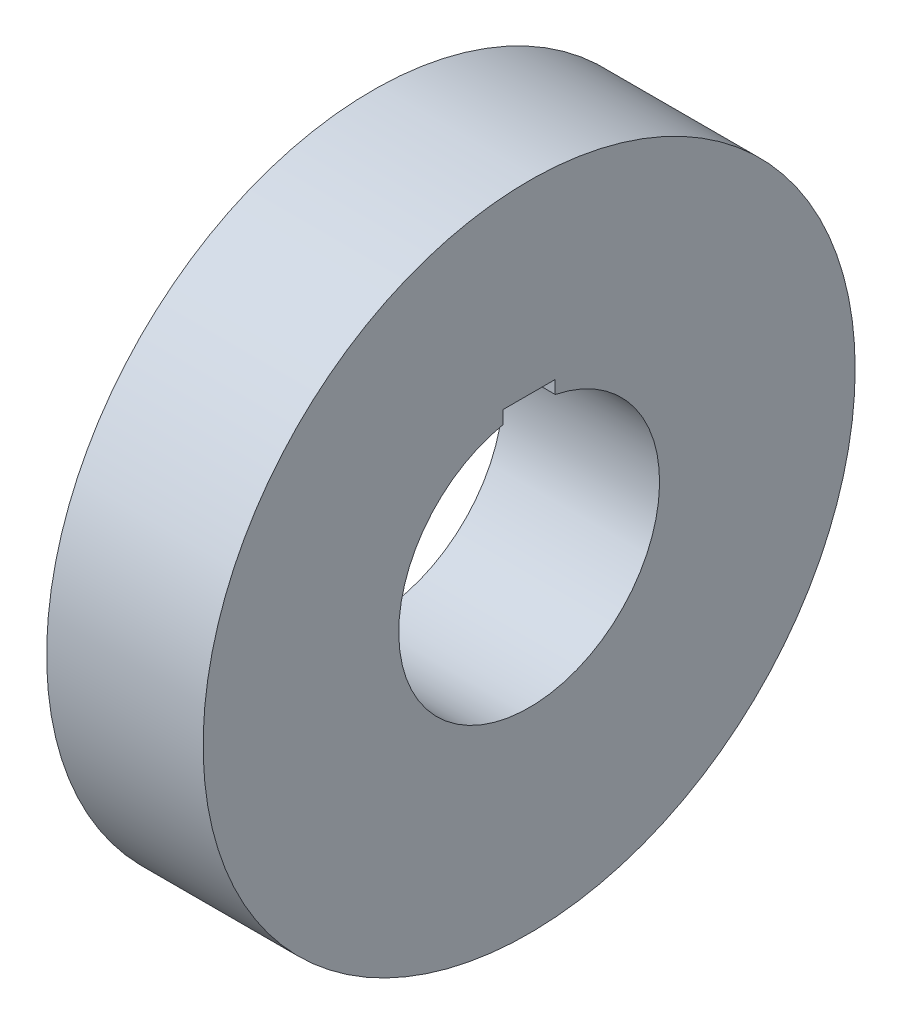
ISO-10303-21;
HEADER;
FILE_DESCRIPTION(('STEP AP214'),'2;1');
FILE_NAME('part.step','',(''),(''),'','','');
FILE_SCHEMA(('AUTOMOTIVE_DESIGN { 1 0 10303 214 1 1 1 1 }'));
ENDSEC;
DATA;
#1=APPLICATION_CONTEXT('core data for automotive mechanical design processes');
#2=APPLICATION_PROTOCOL_DEFINITION('international standard','automotive_design',2000,#1);
#3=PRODUCT_CONTEXT('',#1,'mechanical');
#4=PRODUCT('Part','Part','',(#3));
#5=PRODUCT_RELATED_PRODUCT_CATEGORY('part','',(#4));
#6=PRODUCT_DEFINITION_FORMATION('','',#4);
#7=PRODUCT_DEFINITION_CONTEXT('part definition',#1,'design');
#8=PRODUCT_DEFINITION('design','',#6,#7);
#9=PRODUCT_DEFINITION_SHAPE('','',#8);
#10=(LENGTH_UNIT() NAMED_UNIT(*) SI_UNIT(.MILLI.,.METRE.));
#11=(NAMED_UNIT(*) PLANE_ANGLE_UNIT() SI_UNIT($,.RADIAN.));
#12=(NAMED_UNIT(*) SI_UNIT($,.STERADIAN.) SOLID_ANGLE_UNIT());
#13=UNCERTAINTY_MEASURE_WITH_UNIT(LENGTH_MEASURE(1.E-05),#10,'distance_accuracy_value','');
#14=(GEOMETRIC_REPRESENTATION_CONTEXT(3) GLOBAL_UNCERTAINTY_ASSIGNED_CONTEXT((#13)) GLOBAL_UNIT_ASSIGNED_CONTEXT((#10,
#11,#12)) REPRESENTATION_CONTEXT('',''));
#15=CARTESIAN_POINT('',(0.,0.,0.));
#16=DIRECTION('',(0.,0.,1.));
#17=DIRECTION('',(1.,0.,0.));
#18=AXIS2_PLACEMENT_3D('',#15,#16,#17);
#19=CARTESIAN_POINT('',(12.,0.,0.));
#20=DIRECTION('',(1.,0.,0.));
#21=DIRECTION('',(0.,0.,-1.));
#22=AXIS2_PLACEMENT_3D('',#19,#20,#21);
#23=PLANE('',#22);
#24=DIRECTION('',(0.,-1.,0.));
#25=VECTOR('',#24,1.);
#26=CARTESIAN_POINT('',(12.,0.,1.99999999999999));
#27=LINE('',#26,#25);
#28=CARTESIAN_POINT('',(12.,10.7979589711327,2.));
#29=VERTEX_POINT('',#28);
#30=CARTESIAN_POINT('',(12.,9.79795897113271,2.));
#31=VERTEX_POINT('',#30);
#32=EDGE_CURVE('E82',#29,#31,#27,.T.);
#33=ORIENTED_EDGE('',*,*,#32,.F.);
#34=DIRECTION('',(0.,0.,1.));
#35=VECTOR('',#34,1.);
#36=CARTESIAN_POINT('',(12.,10.7979589711327,0.));
#37=LINE('',#36,#35);
#38=CARTESIAN_POINT('',(12.,10.7979589711327,-2.));
#39=VERTEX_POINT('',#38);
#40=EDGE_CURVE('E106',#39,#29,#37,.T.);
#41=ORIENTED_EDGE('',*,*,#40,.F.);
#42=DIRECTION('',(0.,-1.,0.));
#43=VECTOR('',#42,1.);
#44=CARTESIAN_POINT('',(12.,0.,-2.));
#45=LINE('',#44,#43);
#46=CARTESIAN_POINT('',(12.,9.79795897113271,-2.));
#47=VERTEX_POINT('',#46);
#48=EDGE_CURVE('E88',#39,#47,#45,.T.);
#49=ORIENTED_EDGE('',*,*,#48,.T.);
#50=CARTESIAN_POINT('',(12.,0.,0.));
#51=DIRECTION('',(1.,0.,0.));
#52=DIRECTION('',(0.,0.,-1.));
#53=AXIS2_PLACEMENT_3D('',#50,#51,#52);
#54=CIRCLE('',#53,10.);
#55=EDGE_CURVE('E115',#31,#47,#54,.T.);
#56=ORIENTED_EDGE('',*,*,#55,.F.);
#57=EDGE_LOOP('',(#33,#41,#49,#56));
#58=FACE_BOUND('',#57,.T.);
#59=CARTESIAN_POINT('',(12.,0.,0.));
#60=DIRECTION('',(1.,0.,0.));
#61=DIRECTION('',(0.,0.,-1.));
#62=AXIS2_PLACEMENT_3D('',#59,#60,#61);
#63=CIRCLE('',#62,25.);
#64=CARTESIAN_POINT('',(12.,0.,-25.));
#65=VERTEX_POINT('',#64);
#66=EDGE_CURVE('E11',#65,#65,#63,.T.);
#67=ORIENTED_EDGE('',*,*,#66,.T.);
#68=EDGE_LOOP('',(#67));
#69=FACE_BOUND('',#68,.T.);
#70=ADVANCED_FACE('F42',(#58,#69),#23,.T.);
#71=CARTESIAN_POINT('',(0.,0.,0.));
#72=DIRECTION('',(1.,0.,0.));
#73=DIRECTION('',(0.,0.,-1.));
#74=AXIS2_PLACEMENT_3D('',#71,#72,#73);
#75=PLANE('',#74);
#76=CARTESIAN_POINT('',(0.,0.,0.));
#77=DIRECTION('',(1.,0.,0.));
#78=DIRECTION('',(0.,0.,-1.));
#79=AXIS2_PLACEMENT_3D('',#76,#77,#78);
#80=CIRCLE('',#79,25.);
#81=CARTESIAN_POINT('',(0.,0.,-25.));
#82=VERTEX_POINT('',#81);
#83=EDGE_CURVE('E46',#82,#82,#80,.T.);
#84=ORIENTED_EDGE('',*,*,#83,.F.);
#85=EDGE_LOOP('',(#84));
#86=FACE_BOUND('',#85,.T.);
#87=DIRECTION('',(0.,0.,1.));
#88=VECTOR('',#87,1.);
#89=CARTESIAN_POINT('',(0.,10.7979589711327,0.));
#90=LINE('',#89,#88);
#91=CARTESIAN_POINT('',(0.,10.7979589711327,-2.));
#92=VERTEX_POINT('',#91);
#93=CARTESIAN_POINT('',(0.,10.7979589711327,2.));
#94=VERTEX_POINT('',#93);
#95=EDGE_CURVE('E96',#92,#94,#90,.T.);
#96=ORIENTED_EDGE('',*,*,#95,.T.);
#97=DIRECTION('',(0.,-1.,0.));
#98=VECTOR('',#97,1.);
#99=CARTESIAN_POINT('',(0.,0.,1.99999999999999));
#100=LINE('',#99,#98);
#101=CARTESIAN_POINT('',(0.,9.79795897113271,2.));
#102=VERTEX_POINT('',#101);
#103=EDGE_CURVE('E99',#94,#102,#100,.T.);
#104=ORIENTED_EDGE('',*,*,#103,.T.);
#105=CARTESIAN_POINT('',(0.,0.,0.));
#106=DIRECTION('',(1.,0.,0.));
#107=DIRECTION('',(0.,0.,-1.));
#108=AXIS2_PLACEMENT_3D('',#105,#106,#107);
#109=CIRCLE('',#108,10.);
#110=CARTESIAN_POINT('',(0.,9.79795897113271,-2.));
#111=VERTEX_POINT('',#110);
#112=EDGE_CURVE('E104',#102,#111,#109,.T.);
#113=ORIENTED_EDGE('',*,*,#112,.T.);
#114=DIRECTION('',(0.,-1.,0.));
#115=VECTOR('',#114,1.);
#116=CARTESIAN_POINT('',(0.,0.,-2.));
#117=LINE('',#116,#115);
#118=EDGE_CURVE('E57',#92,#111,#117,.T.);
#119=ORIENTED_EDGE('',*,*,#118,.F.);
#120=EDGE_LOOP('',(#96,#104,#113,#119));
#121=FACE_BOUND('',#120,.T.);
#122=ADVANCED_FACE('F102',(#86,#121),#75,.F.);
#123=CARTESIAN_POINT('',(12.,0.,0.));
#124=DIRECTION('',(-1.,0.,0.));
#125=DIRECTION('',(0.,0.,1.));
#126=AXIS2_PLACEMENT_3D('',#123,#124,#125);
#127=CYLINDRICAL_SURFACE('',#126,25.);
#128=ORIENTED_EDGE('',*,*,#66,.F.);
#129=EDGE_LOOP('',(#128));
#130=FACE_BOUND('',#129,.T.);
#131=ORIENTED_EDGE('',*,*,#83,.T.);
#132=EDGE_LOOP('',(#131));
#133=FACE_BOUND('',#132,.T.);
#134=ADVANCED_FACE('F44',(#130,#133),#127,.T.);
#135=CARTESIAN_POINT('',(12.,0.,0.));
#136=DIRECTION('',(-1.,0.,0.));
#137=DIRECTION('',(0.,0.,1.));
#138=AXIS2_PLACEMENT_3D('',#135,#136,#137);
#139=CYLINDRICAL_SURFACE('',#138,10.);
#140=DIRECTION('',(1.,0.,0.));
#141=VECTOR('',#140,1.);
#142=CARTESIAN_POINT('',(0.,9.79795897113271,2.));
#143=LINE('',#142,#141);
#144=EDGE_CURVE('E66',#102,#31,#143,.T.);
#145=ORIENTED_EDGE('',*,*,#144,.T.);
#146=ORIENTED_EDGE('',*,*,#55,.T.);
#147=DIRECTION('',(1.,0.,0.));
#148=VECTOR('',#147,1.);
#149=CARTESIAN_POINT('',(0.,9.79795897113271,-2.));
#150=LINE('',#149,#148);
#151=EDGE_CURVE('E93',#111,#47,#150,.T.);
#152=ORIENTED_EDGE('',*,*,#151,.F.);
#153=ORIENTED_EDGE('',*,*,#112,.F.);
#154=EDGE_LOOP('',(#145,#146,#152,#153));
#155=FACE_BOUND('',#154,.T.);
#156=ADVANCED_FACE('F129',(#155),#139,.F.);
#157=CARTESIAN_POINT('',(0.,0.,1.99999999999999));
#158=DIRECTION('',(0.,0.,1.));
#159=DIRECTION('',(0.,-1.,0.));
#160=AXIS2_PLACEMENT_3D('',#157,#158,#159);
#161=PLANE('',#160);
#162=ORIENTED_EDGE('',*,*,#32,.T.);
#163=ORIENTED_EDGE('',*,*,#144,.F.);
#164=ORIENTED_EDGE('',*,*,#103,.F.);
#165=DIRECTION('',(1.,0.,0.));
#166=VECTOR('',#165,1.);
#167=CARTESIAN_POINT('',(0.,10.7979589711327,2.));
#168=LINE('',#167,#166);
#169=EDGE_CURVE('E92',#94,#29,#168,.T.);
#170=ORIENTED_EDGE('',*,*,#169,.T.);
#171=EDGE_LOOP('',(#162,#163,#164,#170));
#172=FACE_BOUND('',#171,.T.);
#173=ADVANCED_FACE('F136',(#172),#161,.F.);
#174=CARTESIAN_POINT('',(0.,10.7979589711327,0.));
#175=DIRECTION('',(0.,1.,0.));
#176=DIRECTION('',(0.,0.,1.));
#177=AXIS2_PLACEMENT_3D('',#174,#175,#176);
#178=PLANE('',#177);
#179=ORIENTED_EDGE('',*,*,#40,.T.);
#180=ORIENTED_EDGE('',*,*,#169,.F.);
#181=ORIENTED_EDGE('',*,*,#95,.F.);
#182=DIRECTION('',(1.,0.,0.));
#183=VECTOR('',#182,1.);
#184=CARTESIAN_POINT('',(0.,10.7979589711327,-2.));
#185=LINE('',#184,#183);
#186=EDGE_CURVE('E84',#92,#39,#185,.T.);
#187=ORIENTED_EDGE('',*,*,#186,.T.);
#188=EDGE_LOOP('',(#179,#180,#181,#187));
#189=FACE_BOUND('',#188,.T.);
#190=ADVANCED_FACE('F97',(#189),#178,.F.);
#191=CARTESIAN_POINT('',(0.,0.,-2.));
#192=DIRECTION('',(0.,0.,1.));
#193=DIRECTION('',(1.,0.,0.));
#194=AXIS2_PLACEMENT_3D('',#191,#192,#193);
#195=PLANE('',#194);
#196=ORIENTED_EDGE('',*,*,#48,.F.);
#197=ORIENTED_EDGE('',*,*,#186,.F.);
#198=ORIENTED_EDGE('',*,*,#118,.T.);
#199=ORIENTED_EDGE('',*,*,#151,.T.);
#200=EDGE_LOOP('',(#196,#197,#198,#199));
#201=FACE_BOUND('',#200,.T.);
#202=ADVANCED_FACE('F86',(#201),#195,.T.);
#203=CLOSED_SHELL('',(#70,#122,#134,#156,#173,#190,#202));
#204=MANIFOLD_SOLID_BREP('B2',#203);
#205=ADVANCED_BREP_SHAPE_REPRESENTATION('',(#18,#204),#14);
#206=SHAPE_DEFINITION_REPRESENTATION(#9,#205);
ENDSEC;
END-ISO-10303-21;
